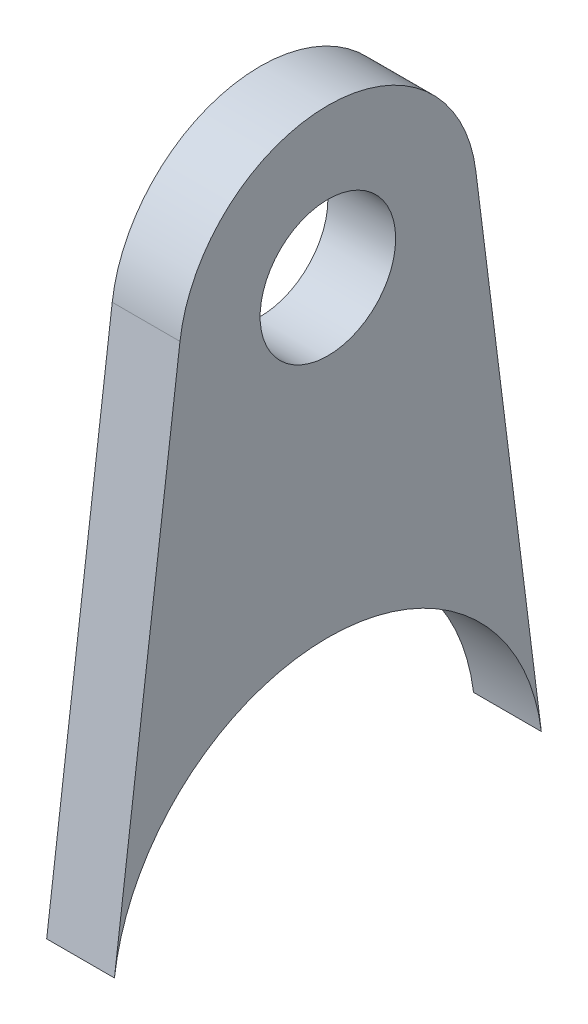
ISO-10303-21;
HEADER;
FILE_DESCRIPTION(('STEP AP214'),'2;1');
FILE_NAME('part.step','',(''),(''),'','','');
FILE_SCHEMA(('AUTOMOTIVE_DESIGN { 1 0 10303 214 1 1 1 1 }'));
ENDSEC;
DATA;
#1=APPLICATION_CONTEXT('core data for automotive mechanical design processes');
#2=APPLICATION_PROTOCOL_DEFINITION('international standard','automotive_design',2000,#1);
#3=PRODUCT_CONTEXT('',#1,'mechanical');
#4=PRODUCT('Part','Part','',(#3));
#5=PRODUCT_RELATED_PRODUCT_CATEGORY('part','',(#4));
#6=PRODUCT_DEFINITION_FORMATION('','',#4);
#7=PRODUCT_DEFINITION_CONTEXT('part definition',#1,'design');
#8=PRODUCT_DEFINITION('design','',#6,#7);
#9=PRODUCT_DEFINITION_SHAPE('','',#8);
#10=(LENGTH_UNIT() NAMED_UNIT(*) SI_UNIT(.MILLI.,.METRE.));
#11=(NAMED_UNIT(*) PLANE_ANGLE_UNIT() SI_UNIT($,.RADIAN.));
#12=(NAMED_UNIT(*) SI_UNIT($,.STERADIAN.) SOLID_ANGLE_UNIT());
#13=UNCERTAINTY_MEASURE_WITH_UNIT(LENGTH_MEASURE(1.E-05),#10,'distance_accuracy_value','');
#14=(GEOMETRIC_REPRESENTATION_CONTEXT(3) GLOBAL_UNCERTAINTY_ASSIGNED_CONTEXT((#13)) GLOBAL_UNIT_ASSIGNED_CONTEXT((#10,
#11,#12)) REPRESENTATION_CONTEXT('',''));
#15=CARTESIAN_POINT('',(0.,0.,0.));
#16=DIRECTION('',(0.,0.,1.));
#17=DIRECTION('',(1.,0.,0.));
#18=AXIS2_PLACEMENT_3D('',#15,#16,#17);
#19=CARTESIAN_POINT('',(2.5,38.875,0.));
#20=DIRECTION('',(1.,0.,0.));
#21=DIRECTION('',(0.,0.,-1.));
#22=AXIS2_PLACEMENT_3D('',#19,#20,#21);
#23=PLANE('',#22);
#24=CARTESIAN_POINT('',(2.5,38.875,0.));
#25=DIRECTION('',(1.,0.,0.));
#26=DIRECTION('',(0.,0.,-1.));
#27=AXIS2_PLACEMENT_3D('',#24,#25,#26);
#28=CIRCLE('',#27,11.);
#29=CARTESIAN_POINT('',(2.5,40.254421221865,-10.9131662267496));
#30=VERTEX_POINT('',#29);
#31=CARTESIAN_POINT('',(2.5,40.254421221865,10.9131662267496));
#32=VERTEX_POINT('',#31);
#33=EDGE_CURVE('E91',#30,#32,#28,.T.);
#34=ORIENTED_EDGE('',*,*,#33,.T.);
#35=DIRECTION('',(0.,-0.992106020613602,0.12540192926045));
#36=VECTOR('',#35,1.);
#37=CARTESIAN_POINT('',(2.5,40.254421221865,10.9131662267496));
#38=LINE('',#37,#36);
#39=CARTESIAN_POINT('',(2.5,1.99075562700965,15.7496830772409));
#40=VERTEX_POINT('',#39);
#41=EDGE_CURVE('E86',#32,#40,#38,.T.);
#42=ORIENTED_EDGE('',*,*,#41,.T.);
#43=CARTESIAN_POINT('',(2.5,0.,0.));
#44=DIRECTION('',(-1.,0.,0.));
#45=DIRECTION('',(0.,0.,-1.));
#46=AXIS2_PLACEMENT_3D('',#43,#44,#45);
#47=CIRCLE('',#46,15.875);
#48=CARTESIAN_POINT('',(2.5,1.99075562700965,-15.7496830772409));
#49=VERTEX_POINT('',#48);
#50=EDGE_CURVE('E89',#40,#49,#47,.T.);
#51=ORIENTED_EDGE('',*,*,#50,.T.);
#52=DIRECTION('',(0.,0.992106020613602,0.12540192926045));
#53=VECTOR('',#52,1.);
#54=CARTESIAN_POINT('',(2.5,40.254421221865,-10.9131662267496));
#55=LINE('',#54,#53);
#56=EDGE_CURVE('E56',#49,#30,#55,.T.);
#57=ORIENTED_EDGE('',*,*,#56,.T.);
#58=EDGE_LOOP('',(#34,#42,#51,#57));
#59=FACE_BOUND('',#58,.T.);
#60=CARTESIAN_POINT('',(2.5,38.875,0.));
#61=DIRECTION('',(1.,0.,0.));
#62=DIRECTION('',(0.,0.,-1.));
#63=AXIS2_PLACEMENT_3D('',#60,#61,#62);
#64=CIRCLE('',#63,5.);
#65=CARTESIAN_POINT('',(2.5,38.875,-5.));
#66=VERTEX_POINT('',#65);
#67=EDGE_CURVE('E106',#66,#66,#64,.T.);
#68=ORIENTED_EDGE('',*,*,#67,.F.);
#69=EDGE_LOOP('',(#68));
#70=FACE_BOUND('',#69,.T.);
#71=ADVANCED_FACE('F39',(#59,#70),#23,.T.);
#72=CARTESIAN_POINT('',(-2.5,38.875,0.));
#73=DIRECTION('',(1.,0.,0.));
#74=DIRECTION('',(0.,0.,-1.));
#75=AXIS2_PLACEMENT_3D('',#72,#73,#74);
#76=PLANE('',#75);
#77=CARTESIAN_POINT('',(-2.5,38.875,0.));
#78=DIRECTION('',(1.,0.,0.));
#79=DIRECTION('',(0.,0.,-1.));
#80=AXIS2_PLACEMENT_3D('',#77,#78,#79);
#81=CIRCLE('',#80,11.);
#82=CARTESIAN_POINT('',(-2.5,40.254421221865,-10.9131662267496));
#83=VERTEX_POINT('',#82);
#84=CARTESIAN_POINT('',(-2.5,40.254421221865,10.9131662267496));
#85=VERTEX_POINT('',#84);
#86=EDGE_CURVE('E103',#83,#85,#81,.T.);
#87=ORIENTED_EDGE('',*,*,#86,.F.);
#88=DIRECTION('',(0.,0.992106020613602,0.12540192926045));
#89=VECTOR('',#88,1.);
#90=CARTESIAN_POINT('',(-2.5,40.254421221865,-10.9131662267496));
#91=LINE('',#90,#89);
#92=CARTESIAN_POINT('',(-2.5,1.99075562700965,-15.7496830772409));
#93=VERTEX_POINT('',#92);
#94=EDGE_CURVE('E79',#93,#83,#91,.T.);
#95=ORIENTED_EDGE('',*,*,#94,.F.);
#96=CARTESIAN_POINT('',(-2.5,0.,0.));
#97=DIRECTION('',(-1.,0.,0.));
#98=DIRECTION('',(0.,0.,-1.));
#99=AXIS2_PLACEMENT_3D('',#96,#97,#98);
#100=CIRCLE('',#99,15.875);
#101=CARTESIAN_POINT('',(-2.5,1.99075562700965,15.7496830772409));
#102=VERTEX_POINT('',#101);
#103=EDGE_CURVE('E73',#102,#93,#100,.T.);
#104=ORIENTED_EDGE('',*,*,#103,.F.);
#105=DIRECTION('',(0.,-0.992106020613602,0.12540192926045));
#106=VECTOR('',#105,1.);
#107=CARTESIAN_POINT('',(-2.5,40.254421221865,10.9131662267496));
#108=LINE('',#107,#106);
#109=EDGE_CURVE('E95',#85,#102,#108,.T.);
#110=ORIENTED_EDGE('',*,*,#109,.F.);
#111=EDGE_LOOP('',(#87,#95,#104,#110));
#112=FACE_BOUND('',#111,.T.);
#113=CARTESIAN_POINT('',(-2.5,38.875,0.));
#114=DIRECTION('',(1.,0.,0.));
#115=DIRECTION('',(0.,0.,-1.));
#116=AXIS2_PLACEMENT_3D('',#113,#114,#115);
#117=CIRCLE('',#116,5.);
#118=CARTESIAN_POINT('',(-2.5,38.875,-5.));
#119=VERTEX_POINT('',#118);
#120=EDGE_CURVE('E118',#119,#119,#117,.T.);
#121=ORIENTED_EDGE('',*,*,#120,.T.);
#122=EDGE_LOOP('',(#121));
#123=FACE_BOUND('',#122,.T.);
#124=ADVANCED_FACE('F114',(#112,#123),#76,.F.);
#125=CARTESIAN_POINT('',(2.5,38.875,0.));
#126=DIRECTION('',(-1.,0.,0.));
#127=DIRECTION('',(0.,0.,1.));
#128=AXIS2_PLACEMENT_3D('',#125,#126,#127);
#129=CYLINDRICAL_SURFACE('',#128,11.);
#130=ORIENTED_EDGE('',*,*,#86,.T.);
#131=DIRECTION('',(-1.,0.,0.));
#132=VECTOR('',#131,1.);
#133=CARTESIAN_POINT('',(2.5,40.254421221865,10.9131662267496));
#134=LINE('',#133,#132);
#135=EDGE_CURVE('E11',#32,#85,#134,.T.);
#136=ORIENTED_EDGE('',*,*,#135,.F.);
#137=ORIENTED_EDGE('',*,*,#33,.F.);
#138=DIRECTION('',(-1.,0.,0.));
#139=VECTOR('',#138,1.);
#140=CARTESIAN_POINT('',(2.5,40.254421221865,-10.9131662267496));
#141=LINE('',#140,#139);
#142=EDGE_CURVE('E99',#30,#83,#141,.T.);
#143=ORIENTED_EDGE('',*,*,#142,.T.);
#144=EDGE_LOOP('',(#130,#136,#137,#143));
#145=FACE_BOUND('',#144,.T.);
#146=ADVANCED_FACE('F41',(#145),#129,.T.);
#147=CARTESIAN_POINT('',(2.5,40.254421221865,10.9131662267496));
#148=DIRECTION('',(0.,-0.12540192926045,-0.992106020613602));
#149=DIRECTION('',(0.,0.992106020613602,-0.12540192926045));
#150=AXIS2_PLACEMENT_3D('',#147,#148,#149);
#151=PLANE('',#150);
#152=ORIENTED_EDGE('',*,*,#109,.T.);
#153=DIRECTION('',(-1.,0.,0.));
#154=VECTOR('',#153,1.);
#155=CARTESIAN_POINT('',(2.5,1.99075562700965,15.7496830772409));
#156=LINE('',#155,#154);
#157=EDGE_CURVE('E48',#40,#102,#156,.T.);
#158=ORIENTED_EDGE('',*,*,#157,.F.);
#159=ORIENTED_EDGE('',*,*,#41,.F.);
#160=ORIENTED_EDGE('',*,*,#135,.T.);
#161=EDGE_LOOP('',(#152,#158,#159,#160));
#162=FACE_BOUND('',#161,.T.);
#163=ADVANCED_FACE('F94',(#162),#151,.F.);
#164=CARTESIAN_POINT('',(2.5,0.,0.));
#165=DIRECTION('',(-1.,0.,0.));
#166=DIRECTION('',(0.,0.,1.));
#167=AXIS2_PLACEMENT_3D('',#164,#165,#166);
#168=CYLINDRICAL_SURFACE('',#167,15.875);
#169=ORIENTED_EDGE('',*,*,#103,.T.);
#170=DIRECTION('',(-1.,0.,0.));
#171=VECTOR('',#170,1.);
#172=CARTESIAN_POINT('',(2.5,1.99075562700965,-15.7496830772409));
#173=LINE('',#172,#171);
#174=EDGE_CURVE('E96',#49,#93,#173,.T.);
#175=ORIENTED_EDGE('',*,*,#174,.F.);
#176=ORIENTED_EDGE('',*,*,#50,.F.);
#177=ORIENTED_EDGE('',*,*,#157,.T.);
#178=EDGE_LOOP('',(#169,#175,#176,#177));
#179=FACE_BOUND('',#178,.T.);
#180=ADVANCED_FACE('F97',(#179),#168,.F.);
#181=CARTESIAN_POINT('',(2.5,40.254421221865,-10.9131662267496));
#182=DIRECTION('',(0.,-0.12540192926045,0.992106020613602));
#183=DIRECTION('',(0.,-0.992106020613602,-0.12540192926045));
#184=AXIS2_PLACEMENT_3D('',#181,#182,#183);
#185=PLANE('',#184);
#186=ORIENTED_EDGE('',*,*,#94,.T.);
#187=ORIENTED_EDGE('',*,*,#142,.F.);
#188=ORIENTED_EDGE('',*,*,#56,.F.);
#189=ORIENTED_EDGE('',*,*,#174,.T.);
#190=EDGE_LOOP('',(#186,#187,#188,#189));
#191=FACE_BOUND('',#190,.T.);
#192=ADVANCED_FACE('F111',(#191),#185,.F.);
#193=CARTESIAN_POINT('',(2.5,38.875,0.));
#194=DIRECTION('',(-1.,0.,0.));
#195=DIRECTION('',(0.,0.,1.));
#196=AXIS2_PLACEMENT_3D('',#193,#194,#195);
#197=CYLINDRICAL_SURFACE('',#196,5.);
#198=ORIENTED_EDGE('',*,*,#67,.T.);
#199=EDGE_LOOP('',(#198));
#200=FACE_BOUND('',#199,.T.);
#201=ORIENTED_EDGE('',*,*,#120,.F.);
#202=EDGE_LOOP('',(#201));
#203=FACE_BOUND('',#202,.T.);
#204=ADVANCED_FACE('F124',(#200,#203),#197,.F.);
#205=CLOSED_SHELL('',(#71,#124,#146,#163,#180,#192,#204));
#206=MANIFOLD_SOLID_BREP('B2',#205);
#207=ADVANCED_BREP_SHAPE_REPRESENTATION('',(#18,#206),#14);
#208=SHAPE_DEFINITION_REPRESENTATION(#9,#207);
ENDSEC;
END-ISO-10303-21;
